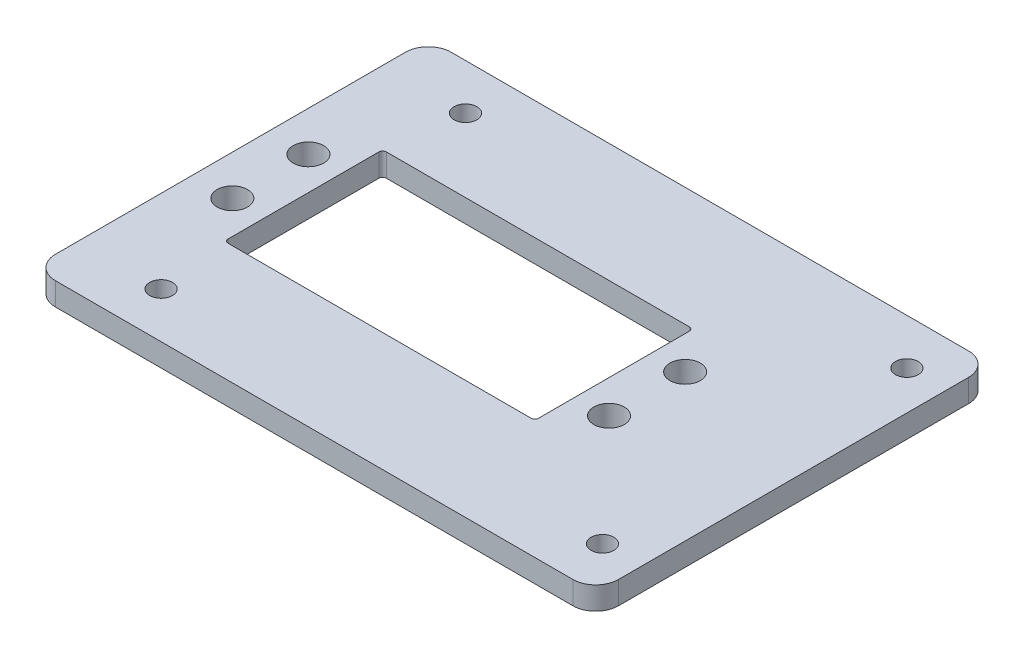
ISO-10303-21;
HEADER;
FILE_DESCRIPTION(('STEP AP214'),'2;1');
FILE_NAME('part.step','',(''),(''),'','','');
FILE_SCHEMA(('AUTOMOTIVE_DESIGN { 1 0 10303 214 1 1 1 1 }'));
ENDSEC;
DATA;
#1=APPLICATION_CONTEXT('core data for automotive mechanical design processes');
#2=APPLICATION_PROTOCOL_DEFINITION('international standard','automotive_design',2000,#1);
#3=PRODUCT_CONTEXT('',#1,'mechanical');
#4=PRODUCT('Part','Part','',(#3));
#5=PRODUCT_RELATED_PRODUCT_CATEGORY('part','',(#4));
#6=PRODUCT_DEFINITION_FORMATION('','',#4);
#7=PRODUCT_DEFINITION_CONTEXT('part definition',#1,'design');
#8=PRODUCT_DEFINITION('design','',#6,#7);
#9=PRODUCT_DEFINITION_SHAPE('','',#8);
#10=(LENGTH_UNIT() NAMED_UNIT(*) SI_UNIT(.MILLI.,.METRE.));
#11=(NAMED_UNIT(*) PLANE_ANGLE_UNIT() SI_UNIT($,.RADIAN.));
#12=(NAMED_UNIT(*) SI_UNIT($,.STERADIAN.) SOLID_ANGLE_UNIT());
#13=UNCERTAINTY_MEASURE_WITH_UNIT(LENGTH_MEASURE(1.E-05),#10,'distance_accuracy_value','');
#14=(GEOMETRIC_REPRESENTATION_CONTEXT(3) GLOBAL_UNCERTAINTY_ASSIGNED_CONTEXT((#13)) GLOBAL_UNIT_ASSIGNED_CONTEXT((#10,
#11,#12)) REPRESENTATION_CONTEXT('',''));
#15=CARTESIAN_POINT('',(0.,0.,0.));
#16=DIRECTION('',(0.,0.,1.));
#17=DIRECTION('',(1.,0.,0.));
#18=AXIS2_PLACEMENT_3D('',#15,#16,#17);
#19=CARTESIAN_POINT('',(20.4,3.,0.));
#20=DIRECTION('',(-1.,0.,0.));
#21=DIRECTION('',(0.,0.,1.));
#22=AXIS2_PLACEMENT_3D('',#19,#20,#21);
#23=PLANE('',#22);
#24=DIRECTION('',(0.,0.,-1.));
#25=VECTOR('',#24,1.);
#26=CARTESIAN_POINT('',(20.4,0.,0.));
#27=LINE('',#26,#25);
#28=CARTESIAN_POINT('',(20.4,0.,9.9));
#29=VERTEX_POINT('',#28);
#30=CARTESIAN_POINT('',(20.4,0.,-9.9));
#31=VERTEX_POINT('',#30);
#32=EDGE_CURVE('E178',#29,#31,#27,.T.);
#33=ORIENTED_EDGE('',*,*,#32,.F.);
#34=DIRECTION('',(0.,-1.,0.));
#35=VECTOR('',#34,1.);
#36=CARTESIAN_POINT('',(20.4,3.,9.9));
#37=LINE('',#36,#35);
#38=CARTESIAN_POINT('',(20.4,3.,9.9));
#39=VERTEX_POINT('',#38);
#40=EDGE_CURVE('E195',#29,#39,#37,.F.);
#41=ORIENTED_EDGE('',*,*,#40,.T.);
#42=DIRECTION('',(0.,0.,-1.));
#43=VECTOR('',#42,1.);
#44=CARTESIAN_POINT('',(20.4,3.,0.));
#45=LINE('',#44,#43);
#46=CARTESIAN_POINT('',(20.4,3.,-9.9));
#47=VERTEX_POINT('',#46);
#48=EDGE_CURVE('E307',#39,#47,#45,.T.);
#49=ORIENTED_EDGE('',*,*,#48,.T.);
#50=DIRECTION('',(0.,-1.,0.));
#51=VECTOR('',#50,1.);
#52=CARTESIAN_POINT('',(20.4,3.,-9.9));
#53=LINE('',#52,#51);
#54=EDGE_CURVE('E184',#47,#31,#53,.T.);
#55=ORIENTED_EDGE('',*,*,#54,.T.);
#56=EDGE_LOOP('',(#33,#41,#49,#55));
#57=FACE_BOUND('',#56,.T.);
#58=ADVANCED_FACE('F43',(#57),#23,.T.);
#59=CARTESIAN_POINT('',(0.,3.,10.4));
#60=DIRECTION('',(0.,0.,-1.));
#61=DIRECTION('',(-1.,0.,0.));
#62=AXIS2_PLACEMENT_3D('',#59,#60,#61);
#63=PLANE('',#62);
#64=DIRECTION('',(1.,0.,0.));
#65=VECTOR('',#64,1.);
#66=CARTESIAN_POINT('',(0.,3.,10.4));
#67=LINE('',#66,#65);
#68=CARTESIAN_POINT('',(-19.9,3.,10.4));
#69=VERTEX_POINT('',#68);
#70=CARTESIAN_POINT('',(19.9,3.,10.4));
#71=VERTEX_POINT('',#70);
#72=EDGE_CURVE('E310',#69,#71,#67,.T.);
#73=ORIENTED_EDGE('',*,*,#72,.T.);
#74=DIRECTION('',(0.,-1.,0.));
#75=VECTOR('',#74,1.);
#76=CARTESIAN_POINT('',(19.9,0.,10.4));
#77=LINE('',#76,#75);
#78=CARTESIAN_POINT('',(19.9,0.,10.4));
#79=VERTEX_POINT('',#78);
#80=EDGE_CURVE('E177',#71,#79,#77,.T.);
#81=ORIENTED_EDGE('',*,*,#80,.T.);
#82=DIRECTION('',(1.,0.,0.));
#83=VECTOR('',#82,1.);
#84=CARTESIAN_POINT('',(0.,0.,10.4));
#85=LINE('',#84,#83);
#86=CARTESIAN_POINT('',(-19.9,0.,10.4));
#87=VERTEX_POINT('',#86);
#88=EDGE_CURVE('E160',#87,#79,#85,.T.);
#89=ORIENTED_EDGE('',*,*,#88,.F.);
#90=DIRECTION('',(0.,-1.,0.));
#91=VECTOR('',#90,1.);
#92=CARTESIAN_POINT('',(-19.9,3.,10.4));
#93=LINE('',#92,#91);
#94=EDGE_CURVE('E174',#87,#69,#93,.F.);
#95=ORIENTED_EDGE('',*,*,#94,.T.);
#96=EDGE_LOOP('',(#73,#81,#89,#95));
#97=FACE_BOUND('',#96,.T.);
#98=ADVANCED_FACE('F173',(#97),#63,.T.);
#99=CARTESIAN_POINT('',(-20.4,3.,0.));
#100=DIRECTION('',(-1.,0.,0.));
#101=DIRECTION('',(0.,0.,1.));
#102=AXIS2_PLACEMENT_3D('',#99,#100,#101);
#103=PLANE('',#102);
#104=DIRECTION('',(0.,0.,-1.));
#105=VECTOR('',#104,1.);
#106=CARTESIAN_POINT('',(-20.4,3.,0.));
#107=LINE('',#106,#105);
#108=CARTESIAN_POINT('',(-20.4,3.,9.9));
#109=VERTEX_POINT('',#108);
#110=CARTESIAN_POINT('',(-20.4,3.,-9.9));
#111=VERTEX_POINT('',#110);
#112=EDGE_CURVE('E312',#109,#111,#107,.T.);
#113=ORIENTED_EDGE('',*,*,#112,.F.);
#114=DIRECTION('',(0.,-1.,0.));
#115=VECTOR('',#114,1.);
#116=CARTESIAN_POINT('',(-20.4,3.,9.9));
#117=LINE('',#116,#115);
#118=CARTESIAN_POINT('',(-20.4,0.,9.9));
#119=VERTEX_POINT('',#118);
#120=EDGE_CURVE('E199',#109,#119,#117,.T.);
#121=ORIENTED_EDGE('',*,*,#120,.T.);
#122=DIRECTION('',(0.,0.,-1.));
#123=VECTOR('',#122,1.);
#124=CARTESIAN_POINT('',(-20.4,0.,0.));
#125=LINE('',#124,#123);
#126=CARTESIAN_POINT('',(-20.4,0.,-9.9));
#127=VERTEX_POINT('',#126);
#128=EDGE_CURVE('E162',#119,#127,#125,.T.);
#129=ORIENTED_EDGE('',*,*,#128,.T.);
#130=DIRECTION('',(0.,-1.,0.));
#131=VECTOR('',#130,1.);
#132=CARTESIAN_POINT('',(-20.4,3.,-9.9));
#133=LINE('',#132,#131);
#134=EDGE_CURVE('E197',#127,#111,#133,.F.);
#135=ORIENTED_EDGE('',*,*,#134,.T.);
#136=EDGE_LOOP('',(#113,#121,#129,#135));
#137=FACE_BOUND('',#136,.T.);
#138=ADVANCED_FACE('F370',(#137),#103,.F.);
#139=CARTESIAN_POINT('',(0.,3.,26.));
#140=DIRECTION('',(0.,0.,-1.));
#141=DIRECTION('',(-1.,0.,0.));
#142=AXIS2_PLACEMENT_3D('',#139,#140,#141);
#143=PLANE('',#142);
#144=DIRECTION('',(1.,0.,0.));
#145=VECTOR('',#144,1.);
#146=CARTESIAN_POINT('',(0.,0.,26.));
#147=LINE('',#146,#145);
#148=CARTESIAN_POINT('',(-27.,0.,26.));
#149=VERTEX_POINT('',#148);
#150=CARTESIAN_POINT('',(41.,0.,26.));
#151=VERTEX_POINT('',#150);
#152=EDGE_CURVE('E338',#149,#151,#147,.T.);
#153=ORIENTED_EDGE('',*,*,#152,.T.);
#154=DIRECTION('',(0.,-1.,0.));
#155=VECTOR('',#154,1.);
#156=CARTESIAN_POINT('',(41.,3.,26.));
#157=LINE('',#156,#155);
#158=CARTESIAN_POINT('',(41.,3.,26.));
#159=VERTEX_POINT('',#158);
#160=EDGE_CURVE('E246',#151,#159,#157,.F.);
#161=ORIENTED_EDGE('',*,*,#160,.T.);
#162=DIRECTION('',(1.,0.,0.));
#163=VECTOR('',#162,1.);
#164=CARTESIAN_POINT('',(0.,3.,26.));
#165=LINE('',#164,#163);
#166=CARTESIAN_POINT('',(-27.,3.,26.));
#167=VERTEX_POINT('',#166);
#168=EDGE_CURVE('E295',#167,#159,#165,.T.);
#169=ORIENTED_EDGE('',*,*,#168,.F.);
#170=DIRECTION('',(0.,-1.,0.));
#171=VECTOR('',#170,1.);
#172=CARTESIAN_POINT('',(-27.,0.,26.));
#173=LINE('',#172,#171);
#174=EDGE_CURVE('E243',#167,#149,#173,.T.);
#175=ORIENTED_EDGE('',*,*,#174,.T.);
#176=EDGE_LOOP('',(#153,#161,#169,#175));
#177=FACE_BOUND('',#176,.T.);
#178=ADVANCED_FACE('F384',(#177),#143,.F.);
#179=CARTESIAN_POINT('',(44.,3.,0.));
#180=DIRECTION('',(1.,0.,0.));
#181=DIRECTION('',(0.,0.,-1.));
#182=AXIS2_PLACEMENT_3D('',#179,#180,#181);
#183=PLANE('',#182);
#184=DIRECTION('',(0.,0.,1.));
#185=VECTOR('',#184,1.);
#186=CARTESIAN_POINT('',(44.,0.,0.));
#187=LINE('',#186,#185);
#188=CARTESIAN_POINT('',(44.,0.,-23.));
#189=VERTEX_POINT('',#188);
#190=CARTESIAN_POINT('',(44.,0.,23.));
#191=VERTEX_POINT('',#190);
#192=EDGE_CURVE('E262',#189,#191,#187,.T.);
#193=ORIENTED_EDGE('',*,*,#192,.F.);
#194=DIRECTION('',(0.,-1.,0.));
#195=VECTOR('',#194,1.);
#196=CARTESIAN_POINT('',(44.,3.,-23.));
#197=LINE('',#196,#195);
#198=CARTESIAN_POINT('',(44.,3.,-23.));
#199=VERTEX_POINT('',#198);
#200=EDGE_CURVE('E234',#189,#199,#197,.F.);
#201=ORIENTED_EDGE('',*,*,#200,.T.);
#202=DIRECTION('',(0.,0.,1.));
#203=VECTOR('',#202,1.);
#204=CARTESIAN_POINT('',(44.,3.,0.));
#205=LINE('',#204,#203);
#206=CARTESIAN_POINT('',(44.,3.,23.));
#207=VERTEX_POINT('',#206);
#208=EDGE_CURVE('E300',#199,#207,#205,.T.);
#209=ORIENTED_EDGE('',*,*,#208,.T.);
#210=DIRECTION('',(0.,-1.,0.));
#211=VECTOR('',#210,1.);
#212=CARTESIAN_POINT('',(44.,0.,23.));
#213=LINE('',#212,#211);
#214=EDGE_CURVE('E231',#207,#191,#213,.T.);
#215=ORIENTED_EDGE('',*,*,#214,.T.);
#216=EDGE_LOOP('',(#193,#201,#209,#215));
#217=FACE_BOUND('',#216,.T.);
#218=ADVANCED_FACE('F344',(#217),#183,.T.);
#219=CARTESIAN_POINT('',(0.,3.,-26.));
#220=DIRECTION('',(0.,0.,-1.));
#221=DIRECTION('',(-1.,0.,0.));
#222=AXIS2_PLACEMENT_3D('',#219,#220,#221);
#223=PLANE('',#222);
#224=DIRECTION('',(1.,0.,0.));
#225=VECTOR('',#224,1.);
#226=CARTESIAN_POINT('',(0.,3.,-26.));
#227=LINE('',#226,#225);
#228=CARTESIAN_POINT('',(-27.,3.,-26.));
#229=VERTEX_POINT('',#228);
#230=CARTESIAN_POINT('',(41.,3.,-26.));
#231=VERTEX_POINT('',#230);
#232=EDGE_CURVE('E303',#229,#231,#227,.T.);
#233=ORIENTED_EDGE('',*,*,#232,.T.);
#234=DIRECTION('',(0.,-1.,0.));
#235=VECTOR('',#234,1.);
#236=CARTESIAN_POINT('',(41.,3.,-26.));
#237=LINE('',#236,#235);
#238=CARTESIAN_POINT('',(41.,0.,-26.));
#239=VERTEX_POINT('',#238);
#240=EDGE_CURVE('E220',#231,#239,#237,.T.);
#241=ORIENTED_EDGE('',*,*,#240,.T.);
#242=DIRECTION('',(1.,0.,0.));
#243=VECTOR('',#242,1.);
#244=CARTESIAN_POINT('',(0.,0.,-26.));
#245=LINE('',#244,#243);
#246=CARTESIAN_POINT('',(-27.,0.,-26.));
#247=VERTEX_POINT('',#246);
#248=EDGE_CURVE('E258',#247,#239,#245,.T.);
#249=ORIENTED_EDGE('',*,*,#248,.F.);
#250=DIRECTION('',(0.,-1.,0.));
#251=VECTOR('',#250,1.);
#252=CARTESIAN_POINT('',(-27.,3.,-26.));
#253=LINE('',#252,#251);
#254=EDGE_CURVE('E218',#247,#229,#253,.F.);
#255=ORIENTED_EDGE('',*,*,#254,.T.);
#256=EDGE_LOOP('',(#233,#241,#249,#255));
#257=FACE_BOUND('',#256,.T.);
#258=ADVANCED_FACE('F354',(#257),#223,.T.);
#259=CARTESIAN_POINT('',(38.89,3.,20.));
#260=DIRECTION('',(0.,-1.,0.));
#261=DIRECTION('',(0.,0.,-1.));
#262=AXIS2_PLACEMENT_3D('',#259,#260,#261);
#263=CYLINDRICAL_SURFACE('',#262,1.5);
#264=CARTESIAN_POINT('',(38.89,3.,20.));
#265=DIRECTION('',(0.,1.,0.));
#266=DIRECTION('',(0.,0.,1.));
#267=AXIS2_PLACEMENT_3D('',#264,#265,#266);
#268=CIRCLE('',#267,1.5);
#269=CARTESIAN_POINT('',(38.89,3.,21.5));
#270=VERTEX_POINT('',#269);
#271=EDGE_CURVE('E187',#270,#270,#268,.T.);
#272=ORIENTED_EDGE('',*,*,#271,.T.);
#273=EDGE_LOOP('',(#272));
#274=FACE_BOUND('',#273,.T.);
#275=CARTESIAN_POINT('',(38.89,0.,20.));
#276=DIRECTION('',(0.,1.,0.));
#277=DIRECTION('',(0.,0.,1.));
#278=AXIS2_PLACEMENT_3D('',#275,#276,#277);
#279=CIRCLE('',#278,1.5);
#280=CARTESIAN_POINT('',(38.89,0.,21.5));
#281=VERTEX_POINT('',#280);
#282=EDGE_CURVE('E281',#281,#281,#279,.T.);
#283=ORIENTED_EDGE('',*,*,#282,.F.);
#284=EDGE_LOOP('',(#283));
#285=FACE_BOUND('',#284,.T.);
#286=ADVANCED_FACE('F381',(#274,#285),#263,.F.);
#287=CARTESIAN_POINT('',(-19.11,3.,20.));
#288=DIRECTION('',(0.,-1.,0.));
#289=DIRECTION('',(0.,0.,-1.));
#290=AXIS2_PLACEMENT_3D('',#287,#288,#289);
#291=CYLINDRICAL_SURFACE('',#290,1.5);
#292=CARTESIAN_POINT('',(-19.11,3.,20.));
#293=DIRECTION('',(0.,1.,0.));
#294=DIRECTION('',(0.,0.,1.));
#295=AXIS2_PLACEMENT_3D('',#292,#293,#294);
#296=CIRCLE('',#295,1.5);
#297=CARTESIAN_POINT('',(-19.11,3.,21.5));
#298=VERTEX_POINT('',#297);
#299=EDGE_CURVE('E327',#298,#298,#296,.F.);
#300=ORIENTED_EDGE('',*,*,#299,.F.);
#301=EDGE_LOOP('',(#300));
#302=FACE_BOUND('',#301,.T.);
#303=CARTESIAN_POINT('',(-19.11,0.,20.));
#304=DIRECTION('',(0.,1.,0.));
#305=DIRECTION('',(0.,0.,1.));
#306=AXIS2_PLACEMENT_3D('',#303,#304,#305);
#307=CIRCLE('',#306,1.5);
#308=CARTESIAN_POINT('',(-19.11,0.,21.5));
#309=VERTEX_POINT('',#308);
#310=EDGE_CURVE('E279',#309,#309,#307,.F.);
#311=ORIENTED_EDGE('',*,*,#310,.T.);
#312=EDGE_LOOP('',(#311));
#313=FACE_BOUND('',#312,.T.);
#314=ADVANCED_FACE('F532',(#302,#313),#291,.F.);
#315=CARTESIAN_POINT('',(-19.11,3.,-20.));
#316=DIRECTION('',(0.,-1.,0.));
#317=DIRECTION('',(0.,0.,-1.));
#318=AXIS2_PLACEMENT_3D('',#315,#316,#317);
#319=CYLINDRICAL_SURFACE('',#318,1.5);
#320=CARTESIAN_POINT('',(-19.11,3.,-20.));
#321=DIRECTION('',(0.,1.,0.));
#322=DIRECTION('',(0.,0.,1.));
#323=AXIS2_PLACEMENT_3D('',#320,#321,#322);
#324=CIRCLE('',#323,1.5);
#325=CARTESIAN_POINT('',(-19.11,3.,-18.5));
#326=VERTEX_POINT('',#325);
#327=EDGE_CURVE('E324',#326,#326,#324,.T.);
#328=ORIENTED_EDGE('',*,*,#327,.T.);
#329=EDGE_LOOP('',(#328));
#330=FACE_BOUND('',#329,.T.);
#331=CARTESIAN_POINT('',(-19.11,0.,-20.));
#332=DIRECTION('',(0.,1.,0.));
#333=DIRECTION('',(0.,0.,1.));
#334=AXIS2_PLACEMENT_3D('',#331,#332,#333);
#335=CIRCLE('',#334,1.5);
#336=CARTESIAN_POINT('',(-19.11,0.,-18.5));
#337=VERTEX_POINT('',#336);
#338=EDGE_CURVE('E276',#337,#337,#335,.T.);
#339=ORIENTED_EDGE('',*,*,#338,.F.);
#340=EDGE_LOOP('',(#339));
#341=FACE_BOUND('',#340,.T.);
#342=ADVANCED_FACE('F523',(#330,#341),#319,.F.);
#343=CARTESIAN_POINT('',(24.75,3.,4.99999999999999));
#344=DIRECTION('',(0.,-1.,0.));
#345=DIRECTION('',(0.,0.,-1.));
#346=AXIS2_PLACEMENT_3D('',#343,#344,#345);
#347=CYLINDRICAL_SURFACE('',#346,2.);
#348=CARTESIAN_POINT('',(24.75,3.,4.99999999999999));
#349=DIRECTION('',(0.,1.,0.));
#350=DIRECTION('',(0.,0.,1.));
#351=AXIS2_PLACEMENT_3D('',#348,#349,#350);
#352=CIRCLE('',#351,2.);
#353=CARTESIAN_POINT('',(24.75,3.,7.));
#354=VERTEX_POINT('',#353);
#355=EDGE_CURVE('E321',#354,#354,#352,.F.);
#356=ORIENTED_EDGE('',*,*,#355,.F.);
#357=EDGE_LOOP('',(#356));
#358=FACE_BOUND('',#357,.T.);
#359=CARTESIAN_POINT('',(24.75,0.,4.99999999999999));
#360=DIRECTION('',(0.,1.,0.));
#361=DIRECTION('',(0.,0.,1.));
#362=AXIS2_PLACEMENT_3D('',#359,#360,#361);
#363=CIRCLE('',#362,2.);
#364=CARTESIAN_POINT('',(24.75,0.,7.));
#365=VERTEX_POINT('',#364);
#366=EDGE_CURVE('E273',#365,#365,#363,.F.);
#367=ORIENTED_EDGE('',*,*,#366,.T.);
#368=EDGE_LOOP('',(#367));
#369=FACE_BOUND('',#368,.T.);
#370=ADVANCED_FACE('F514',(#358,#369),#347,.F.);
#371=CARTESIAN_POINT('',(24.75,3.,-5.00000000000001));
#372=DIRECTION('',(0.,-1.,0.));
#373=DIRECTION('',(0.,0.,-1.));
#374=AXIS2_PLACEMENT_3D('',#371,#372,#373);
#375=CYLINDRICAL_SURFACE('',#374,2.);
#376=CARTESIAN_POINT('',(24.75,3.,-5.00000000000001));
#377=DIRECTION('',(0.,1.,0.));
#378=DIRECTION('',(0.,0.,1.));
#379=AXIS2_PLACEMENT_3D('',#376,#377,#378);
#380=CIRCLE('',#379,2.);
#381=CARTESIAN_POINT('',(24.75,3.,-3.));
#382=VERTEX_POINT('',#381);
#383=EDGE_CURVE('E318',#382,#382,#380,.T.);
#384=ORIENTED_EDGE('',*,*,#383,.T.);
#385=EDGE_LOOP('',(#384));
#386=FACE_BOUND('',#385,.T.);
#387=CARTESIAN_POINT('',(24.75,0.,-5.00000000000001));
#388=DIRECTION('',(0.,1.,0.));
#389=DIRECTION('',(0.,0.,1.));
#390=AXIS2_PLACEMENT_3D('',#387,#388,#389);
#391=CIRCLE('',#390,2.);
#392=CARTESIAN_POINT('',(24.75,0.,-3.));
#393=VERTEX_POINT('',#392);
#394=EDGE_CURVE('E270',#393,#393,#391,.T.);
#395=ORIENTED_EDGE('',*,*,#394,.F.);
#396=EDGE_LOOP('',(#395));
#397=FACE_BOUND('',#396,.T.);
#398=ADVANCED_FACE('F505',(#386,#397),#375,.F.);
#399=CARTESIAN_POINT('',(0.,3.,-10.4));
#400=DIRECTION('',(0.,0.,-1.));
#401=DIRECTION('',(-1.,0.,0.));
#402=AXIS2_PLACEMENT_3D('',#399,#400,#401);
#403=PLANE('',#402);
#404=DIRECTION('',(1.,0.,0.));
#405=VECTOR('',#404,1.);
#406=CARTESIAN_POINT('',(0.,0.,-10.4));
#407=LINE('',#406,#405);
#408=CARTESIAN_POINT('',(-19.9,0.,-10.4));
#409=VERTEX_POINT('',#408);
#410=CARTESIAN_POINT('',(19.9,0.,-10.4));
#411=VERTEX_POINT('',#410);
#412=EDGE_CURVE('E267',#409,#411,#407,.T.);
#413=ORIENTED_EDGE('',*,*,#412,.T.);
#414=DIRECTION('',(0.,-1.,0.));
#415=VECTOR('',#414,1.);
#416=CARTESIAN_POINT('',(19.9,3.,-10.4));
#417=LINE('',#416,#415);
#418=CARTESIAN_POINT('',(19.9,3.,-10.4));
#419=VERTEX_POINT('',#418);
#420=EDGE_CURVE('E204',#411,#419,#417,.F.);
#421=ORIENTED_EDGE('',*,*,#420,.T.);
#422=DIRECTION('',(1.,0.,0.));
#423=VECTOR('',#422,1.);
#424=CARTESIAN_POINT('',(0.,3.,-10.4));
#425=LINE('',#424,#423);
#426=CARTESIAN_POINT('',(-19.9,3.,-10.4));
#427=VERTEX_POINT('',#426);
#428=EDGE_CURVE('E315',#427,#419,#425,.T.);
#429=ORIENTED_EDGE('',*,*,#428,.F.);
#430=DIRECTION('',(0.,-1.,0.));
#431=VECTOR('',#430,1.);
#432=CARTESIAN_POINT('',(-19.9,0.,-10.4));
#433=LINE('',#432,#431);
#434=EDGE_CURVE('E201',#427,#409,#433,.T.);
#435=ORIENTED_EDGE('',*,*,#434,.T.);
#436=EDGE_LOOP('',(#413,#421,#429,#435));
#437=FACE_BOUND('',#436,.T.);
#438=ADVANCED_FACE('F378',(#437),#403,.F.);
#439=CARTESIAN_POINT('',(-30.,3.,0.));
#440=DIRECTION('',(-1.,0.,0.));
#441=DIRECTION('',(0.,0.,1.));
#442=AXIS2_PLACEMENT_3D('',#439,#440,#441);
#443=PLANE('',#442);
#444=DIRECTION('',(0.,0.,-1.));
#445=VECTOR('',#444,1.);
#446=CARTESIAN_POINT('',(-30.,0.,0.));
#447=LINE('',#446,#445);
#448=CARTESIAN_POINT('',(-30.,0.,23.));
#449=VERTEX_POINT('',#448);
#450=CARTESIAN_POINT('',(-30.,0.,-23.));
#451=VERTEX_POINT('',#450);
#452=EDGE_CURVE('E251',#449,#451,#447,.T.);
#453=ORIENTED_EDGE('',*,*,#452,.F.);
#454=DIRECTION('',(0.,-1.,0.));
#455=VECTOR('',#454,1.);
#456=CARTESIAN_POINT('',(-30.,3.,23.));
#457=LINE('',#456,#455);
#458=CARTESIAN_POINT('',(-30.,3.,23.));
#459=VERTEX_POINT('',#458);
#460=EDGE_CURVE('E11',#449,#459,#457,.F.);
#461=ORIENTED_EDGE('',*,*,#460,.T.);
#462=DIRECTION('',(0.,0.,-1.));
#463=VECTOR('',#462,1.);
#464=CARTESIAN_POINT('',(-30.,3.,0.));
#465=LINE('',#464,#463);
#466=CARTESIAN_POINT('',(-30.,3.,-23.));
#467=VERTEX_POINT('',#466);
#468=EDGE_CURVE('E252',#459,#467,#465,.T.);
#469=ORIENTED_EDGE('',*,*,#468,.T.);
#470=DIRECTION('',(0.,-1.,0.));
#471=VECTOR('',#470,1.);
#472=CARTESIAN_POINT('',(-30.,3.,-23.));
#473=LINE('',#472,#471);
#474=EDGE_CURVE('E51',#467,#451,#473,.T.);
#475=ORIENTED_EDGE('',*,*,#474,.T.);
#476=EDGE_LOOP('',(#453,#461,#469,#475));
#477=FACE_BOUND('',#476,.T.);
#478=ADVANCED_FACE('F250',(#477),#443,.T.);
#479=CARTESIAN_POINT('',(-24.75,3.,4.99999999999999));
#480=DIRECTION('',(0.,-1.,0.));
#481=DIRECTION('',(0.,0.,-1.));
#482=AXIS2_PLACEMENT_3D('',#479,#480,#481);
#483=CYLINDRICAL_SURFACE('',#482,2.);
#484=CARTESIAN_POINT('',(-24.75,3.,4.99999999999999));
#485=DIRECTION('',(0.,1.,0.));
#486=DIRECTION('',(0.,0.,1.));
#487=AXIS2_PLACEMENT_3D('',#484,#485,#486);
#488=CIRCLE('',#487,2.);
#489=CARTESIAN_POINT('',(-24.75,3.,7.));
#490=VERTEX_POINT('',#489);
#491=EDGE_CURVE('E290',#490,#490,#488,.T.);
#492=ORIENTED_EDGE('',*,*,#491,.T.);
#493=EDGE_LOOP('',(#492));
#494=FACE_BOUND('',#493,.T.);
#495=CARTESIAN_POINT('',(-24.75,0.,4.99999999999999));
#496=DIRECTION('',(0.,1.,0.));
#497=DIRECTION('',(0.,0.,1.));
#498=AXIS2_PLACEMENT_3D('',#495,#496,#497);
#499=CIRCLE('',#498,2.);
#500=CARTESIAN_POINT('',(-24.75,0.,7.));
#501=VERTEX_POINT('',#500);
#502=EDGE_CURVE('E335',#501,#501,#499,.T.);
#503=ORIENTED_EDGE('',*,*,#502,.F.);
#504=EDGE_LOOP('',(#503));
#505=FACE_BOUND('',#504,.T.);
#506=ADVANCED_FACE('F377',(#494,#505),#483,.F.);
#507=CARTESIAN_POINT('',(-24.75,3.,-5.00000000000001));
#508=DIRECTION('',(0.,-1.,0.));
#509=DIRECTION('',(0.,0.,-1.));
#510=AXIS2_PLACEMENT_3D('',#507,#508,#509);
#511=CYLINDRICAL_SURFACE('',#510,2.);
#512=CARTESIAN_POINT('',(-24.75,3.,-5.00000000000001));
#513=DIRECTION('',(0.,1.,0.));
#514=DIRECTION('',(0.,0.,1.));
#515=AXIS2_PLACEMENT_3D('',#512,#513,#514);
#516=CIRCLE('',#515,2.);
#517=CARTESIAN_POINT('',(-24.75,3.,-3.));
#518=VERTEX_POINT('',#517);
#519=EDGE_CURVE('E286',#518,#518,#516,.F.);
#520=ORIENTED_EDGE('',*,*,#519,.F.);
#521=EDGE_LOOP('',(#520));
#522=FACE_BOUND('',#521,.T.);
#523=CARTESIAN_POINT('',(-24.75,0.,-5.00000000000001));
#524=DIRECTION('',(0.,1.,0.));
#525=DIRECTION('',(0.,0.,1.));
#526=AXIS2_PLACEMENT_3D('',#523,#524,#525);
#527=CIRCLE('',#526,2.);
#528=CARTESIAN_POINT('',(-24.75,0.,-3.));
#529=VERTEX_POINT('',#528);
#530=EDGE_CURVE('E332',#529,#529,#527,.F.);
#531=ORIENTED_EDGE('',*,*,#530,.T.);
#532=EDGE_LOOP('',(#531));
#533=FACE_BOUND('',#532,.T.);
#534=ADVANCED_FACE('F390',(#522,#533),#511,.F.);
#535=CARTESIAN_POINT('',(38.89,3.,-20.));
#536=DIRECTION('',(0.,-1.,0.));
#537=DIRECTION('',(0.,0.,-1.));
#538=AXIS2_PLACEMENT_3D('',#535,#536,#537);
#539=CYLINDRICAL_SURFACE('',#538,1.5);
#540=CARTESIAN_POINT('',(38.89,3.,-20.));
#541=DIRECTION('',(0.,1.,0.));
#542=DIRECTION('',(0.,0.,1.));
#543=AXIS2_PLACEMENT_3D('',#540,#541,#542);
#544=CIRCLE('',#543,1.5);
#545=CARTESIAN_POINT('',(38.89,3.,-18.5));
#546=VERTEX_POINT('',#545);
#547=EDGE_CURVE('E182',#546,#546,#544,.F.);
#548=ORIENTED_EDGE('',*,*,#547,.F.);
#549=EDGE_LOOP('',(#548));
#550=FACE_BOUND('',#549,.T.);
#551=CARTESIAN_POINT('',(38.89,0.,-20.));
#552=DIRECTION('',(0.,1.,0.));
#553=DIRECTION('',(0.,0.,1.));
#554=AXIS2_PLACEMENT_3D('',#551,#552,#553);
#555=CIRCLE('',#554,1.5);
#556=CARTESIAN_POINT('',(38.89,0.,-18.5));
#557=VERTEX_POINT('',#556);
#558=EDGE_CURVE('E190',#557,#557,#555,.F.);
#559=ORIENTED_EDGE('',*,*,#558,.T.);
#560=EDGE_LOOP('',(#559));
#561=FACE_BOUND('',#560,.T.);
#562=ADVANCED_FACE('F394',(#550,#561),#539,.F.);
#563=CARTESIAN_POINT('',(0.,3.,0.));
#564=DIRECTION('',(0.,1.,0.));
#565=DIRECTION('',(0.,0.,1.));
#566=AXIS2_PLACEMENT_3D('',#563,#564,#565);
#567=PLANE('',#566);
#568=ORIENTED_EDGE('',*,*,#519,.T.);
#569=EDGE_LOOP('',(#568));
#570=FACE_BOUND('',#569,.T.);
#571=ORIENTED_EDGE('',*,*,#491,.F.);
#572=EDGE_LOOP('',(#571));
#573=FACE_BOUND('',#572,.T.);
#574=ORIENTED_EDGE('',*,*,#208,.F.);
#575=CARTESIAN_POINT('',(41.,3.,-23.));
#576=DIRECTION('',(0.,1.,0.));
#577=DIRECTION('',(0.,0.,1.));
#578=AXIS2_PLACEMENT_3D('',#575,#576,#577);
#579=CIRCLE('',#578,3.);
#580=EDGE_CURVE('E241',#199,#231,#579,.T.);
#581=ORIENTED_EDGE('',*,*,#580,.T.);
#582=ORIENTED_EDGE('',*,*,#232,.F.);
#583=CARTESIAN_POINT('',(-27.,3.,-23.));
#584=DIRECTION('',(0.,1.,0.));
#585=DIRECTION('',(0.,0.,1.));
#586=AXIS2_PLACEMENT_3D('',#583,#584,#585);
#587=CIRCLE('',#586,3.);
#588=EDGE_CURVE('E58',#229,#467,#587,.T.);
#589=ORIENTED_EDGE('',*,*,#588,.T.);
#590=ORIENTED_EDGE('',*,*,#468,.F.);
#591=CARTESIAN_POINT('',(-27.,3.,23.));
#592=DIRECTION('',(0.,1.,0.));
#593=DIRECTION('',(0.,0.,1.));
#594=AXIS2_PLACEMENT_3D('',#591,#592,#593);
#595=CIRCLE('',#594,3.);
#596=EDGE_CURVE('E237',#459,#167,#595,.T.);
#597=ORIENTED_EDGE('',*,*,#596,.T.);
#598=ORIENTED_EDGE('',*,*,#168,.T.);
#599=CARTESIAN_POINT('',(41.,3.,23.));
#600=DIRECTION('',(0.,1.,0.));
#601=DIRECTION('',(0.,0.,1.));
#602=AXIS2_PLACEMENT_3D('',#599,#600,#601);
#603=CIRCLE('',#602,3.);
#604=EDGE_CURVE('E239',#159,#207,#603,.T.);
#605=ORIENTED_EDGE('',*,*,#604,.T.);
#606=EDGE_LOOP('',(#574,#581,#582,#589,#590,#597,#598,#605));
#607=FACE_BOUND('',#606,.T.);
#608=ORIENTED_EDGE('',*,*,#48,.F.);
#609=CARTESIAN_POINT('',(19.9,3.,9.9));
#610=DIRECTION('',(0.,1.,0.));
#611=DIRECTION('',(0.,0.,1.));
#612=AXIS2_PLACEMENT_3D('',#609,#610,#611);
#613=CIRCLE('',#612,0.5);
#614=EDGE_CURVE('E168',#39,#71,#613,.F.);
#615=ORIENTED_EDGE('',*,*,#614,.T.);
#616=ORIENTED_EDGE('',*,*,#72,.F.);
#617=CARTESIAN_POINT('',(-19.9,3.,9.9));
#618=DIRECTION('',(0.,1.,0.));
#619=DIRECTION('',(0.,0.,1.));
#620=AXIS2_PLACEMENT_3D('',#617,#618,#619);
#621=CIRCLE('',#620,0.5);
#622=EDGE_CURVE('E167',#69,#109,#621,.F.);
#623=ORIENTED_EDGE('',*,*,#622,.T.);
#624=ORIENTED_EDGE('',*,*,#112,.T.);
#625=CARTESIAN_POINT('',(-19.9,3.,-9.9));
#626=DIRECTION('',(0.,1.,0.));
#627=DIRECTION('',(0.,0.,1.));
#628=AXIS2_PLACEMENT_3D('',#625,#626,#627);
#629=CIRCLE('',#628,0.5);
#630=EDGE_CURVE('E216',#111,#427,#629,.F.);
#631=ORIENTED_EDGE('',*,*,#630,.T.);
#632=ORIENTED_EDGE('',*,*,#428,.T.);
#633=CARTESIAN_POINT('',(19.9,3.,-9.9));
#634=DIRECTION('',(0.,1.,0.));
#635=DIRECTION('',(0.,0.,1.));
#636=AXIS2_PLACEMENT_3D('',#633,#634,#635);
#637=CIRCLE('',#636,0.5);
#638=EDGE_CURVE('E212',#419,#47,#637,.F.);
#639=ORIENTED_EDGE('',*,*,#638,.T.);
#640=EDGE_LOOP('',(#608,#615,#616,#623,#624,#631,#632,#639));
#641=FACE_BOUND('',#640,.T.);
#642=ORIENTED_EDGE('',*,*,#383,.F.);
#643=EDGE_LOOP('',(#642));
#644=FACE_BOUND('',#643,.T.);
#645=ORIENTED_EDGE('',*,*,#355,.T.);
#646=EDGE_LOOP('',(#645));
#647=FACE_BOUND('',#646,.T.);
#648=ORIENTED_EDGE('',*,*,#327,.F.);
#649=EDGE_LOOP('',(#648));
#650=FACE_BOUND('',#649,.T.);
#651=ORIENTED_EDGE('',*,*,#299,.T.);
#652=EDGE_LOOP('',(#651));
#653=FACE_BOUND('',#652,.T.);
#654=ORIENTED_EDGE('',*,*,#271,.F.);
#655=EDGE_LOOP('',(#654));
#656=FACE_BOUND('',#655,.T.);
#657=ORIENTED_EDGE('',*,*,#547,.T.);
#658=EDGE_LOOP('',(#657));
#659=FACE_BOUND('',#658,.T.);
#660=ADVANCED_FACE('F351',(#570,#573,#607,#641,#644,#647,#650,#653,#656,#659),#567,.T.);
#661=CARTESIAN_POINT('',(0.,0.,0.));
#662=DIRECTION('',(0.,1.,0.));
#663=DIRECTION('',(0.,0.,1.));
#664=AXIS2_PLACEMENT_3D('',#661,#662,#663);
#665=PLANE('',#664);
#666=ORIENTED_EDGE('',*,*,#530,.F.);
#667=EDGE_LOOP('',(#666));
#668=FACE_BOUND('',#667,.T.);
#669=ORIENTED_EDGE('',*,*,#502,.T.);
#670=EDGE_LOOP('',(#669));
#671=FACE_BOUND('',#670,.T.);
#672=ORIENTED_EDGE('',*,*,#248,.T.);
#673=CARTESIAN_POINT('',(41.,0.,-23.));
#674=DIRECTION('',(0.,1.,0.));
#675=DIRECTION('',(0.,0.,1.));
#676=AXIS2_PLACEMENT_3D('',#673,#674,#675);
#677=CIRCLE('',#676,3.);
#678=EDGE_CURVE('E229',#239,#189,#677,.F.);
#679=ORIENTED_EDGE('',*,*,#678,.T.);
#680=ORIENTED_EDGE('',*,*,#192,.T.);
#681=CARTESIAN_POINT('',(41.,0.,23.));
#682=DIRECTION('',(0.,1.,0.));
#683=DIRECTION('',(0.,0.,1.));
#684=AXIS2_PLACEMENT_3D('',#681,#682,#683);
#685=CIRCLE('',#684,3.);
#686=EDGE_CURVE('E227',#191,#151,#685,.F.);
#687=ORIENTED_EDGE('',*,*,#686,.T.);
#688=ORIENTED_EDGE('',*,*,#152,.F.);
#689=CARTESIAN_POINT('',(-27.,0.,23.));
#690=DIRECTION('',(0.,1.,0.));
#691=DIRECTION('',(0.,0.,1.));
#692=AXIS2_PLACEMENT_3D('',#689,#690,#691);
#693=CIRCLE('',#692,3.);
#694=EDGE_CURVE('E225',#149,#449,#693,.F.);
#695=ORIENTED_EDGE('',*,*,#694,.T.);
#696=ORIENTED_EDGE('',*,*,#452,.T.);
#697=CARTESIAN_POINT('',(-27.,0.,-23.));
#698=DIRECTION('',(0.,1.,0.));
#699=DIRECTION('',(0.,0.,1.));
#700=AXIS2_PLACEMENT_3D('',#697,#698,#699);
#701=CIRCLE('',#700,3.);
#702=EDGE_CURVE('E223',#451,#247,#701,.F.);
#703=ORIENTED_EDGE('',*,*,#702,.T.);
#704=EDGE_LOOP('',(#672,#679,#680,#687,#688,#695,#696,#703));
#705=FACE_BOUND('',#704,.T.);
#706=ORIENTED_EDGE('',*,*,#88,.T.);
#707=CARTESIAN_POINT('',(19.9,0.,9.9));
#708=DIRECTION('',(0.,1.,0.));
#709=DIRECTION('',(0.,0.,1.));
#710=AXIS2_PLACEMENT_3D('',#707,#708,#709);
#711=CIRCLE('',#710,0.5);
#712=EDGE_CURVE('E206',#79,#29,#711,.T.);
#713=ORIENTED_EDGE('',*,*,#712,.T.);
#714=ORIENTED_EDGE('',*,*,#32,.T.);
#715=CARTESIAN_POINT('',(19.9,0.,-9.9));
#716=DIRECTION('',(0.,1.,0.));
#717=DIRECTION('',(0.,0.,1.));
#718=AXIS2_PLACEMENT_3D('',#715,#716,#717);
#719=CIRCLE('',#718,0.5);
#720=EDGE_CURVE('E210',#31,#411,#719,.T.);
#721=ORIENTED_EDGE('',*,*,#720,.T.);
#722=ORIENTED_EDGE('',*,*,#412,.F.);
#723=CARTESIAN_POINT('',(-19.9,0.,-9.9));
#724=DIRECTION('',(0.,1.,0.));
#725=DIRECTION('',(0.,0.,1.));
#726=AXIS2_PLACEMENT_3D('',#723,#724,#725);
#727=CIRCLE('',#726,0.5);
#728=EDGE_CURVE('E214',#409,#127,#727,.T.);
#729=ORIENTED_EDGE('',*,*,#728,.T.);
#730=ORIENTED_EDGE('',*,*,#128,.F.);
#731=CARTESIAN_POINT('',(-19.9,0.,9.9));
#732=DIRECTION('',(0.,1.,0.));
#733=DIRECTION('',(0.,0.,1.));
#734=AXIS2_PLACEMENT_3D('',#731,#732,#733);
#735=CIRCLE('',#734,0.5);
#736=EDGE_CURVE('E156',#119,#87,#735,.T.);
#737=ORIENTED_EDGE('',*,*,#736,.T.);
#738=EDGE_LOOP('',(#706,#713,#714,#721,#722,#729,#730,#737));
#739=FACE_BOUND('',#738,.T.);
#740=ORIENTED_EDGE('',*,*,#394,.T.);
#741=EDGE_LOOP('',(#740));
#742=FACE_BOUND('',#741,.T.);
#743=ORIENTED_EDGE('',*,*,#366,.F.);
#744=EDGE_LOOP('',(#743));
#745=FACE_BOUND('',#744,.T.);
#746=ORIENTED_EDGE('',*,*,#338,.T.);
#747=EDGE_LOOP('',(#746));
#748=FACE_BOUND('',#747,.T.);
#749=ORIENTED_EDGE('',*,*,#310,.F.);
#750=EDGE_LOOP('',(#749));
#751=FACE_BOUND('',#750,.T.);
#752=ORIENTED_EDGE('',*,*,#282,.T.);
#753=EDGE_LOOP('',(#752));
#754=FACE_BOUND('',#753,.T.);
#755=ORIENTED_EDGE('',*,*,#558,.F.);
#756=EDGE_LOOP('',(#755));
#757=FACE_BOUND('',#756,.T.);
#758=ADVANCED_FACE('F158',(#668,#671,#705,#739,#742,#745,#748,#751,#754,#757),#665,.F.);
#759=CARTESIAN_POINT('',(19.9,3.,9.9));
#760=DIRECTION('',(0.,1.,0.));
#761=DIRECTION('',(0.,0.,1.));
#762=AXIS2_PLACEMENT_3D('',#759,#760,#761);
#763=CYLINDRICAL_SURFACE('',#762,0.5);
#764=ORIENTED_EDGE('',*,*,#614,.F.);
#765=ORIENTED_EDGE('',*,*,#40,.F.);
#766=ORIENTED_EDGE('',*,*,#712,.F.);
#767=ORIENTED_EDGE('',*,*,#80,.F.);
#768=EDGE_LOOP('',(#764,#765,#766,#767));
#769=FACE_BOUND('',#768,.T.);
#770=ADVANCED_FACE('F396',(#769),#763,.F.);
#771=CARTESIAN_POINT('',(-19.9,3.,9.9));
#772=DIRECTION('',(0.,-1.,0.));
#773=DIRECTION('',(0.,0.,-1.));
#774=AXIS2_PLACEMENT_3D('',#771,#772,#773);
#775=CYLINDRICAL_SURFACE('',#774,0.5);
#776=ORIENTED_EDGE('',*,*,#622,.F.);
#777=ORIENTED_EDGE('',*,*,#94,.F.);
#778=ORIENTED_EDGE('',*,*,#736,.F.);
#779=ORIENTED_EDGE('',*,*,#120,.F.);
#780=EDGE_LOOP('',(#776,#777,#778,#779));
#781=FACE_BOUND('',#780,.T.);
#782=ADVANCED_FACE('F181',(#781),#775,.F.);
#783=CARTESIAN_POINT('',(19.9,3.,-9.9));
#784=DIRECTION('',(0.,-1.,0.));
#785=DIRECTION('',(0.,0.,-1.));
#786=AXIS2_PLACEMENT_3D('',#783,#784,#785);
#787=CYLINDRICAL_SURFACE('',#786,0.5);
#788=ORIENTED_EDGE('',*,*,#638,.F.);
#789=ORIENTED_EDGE('',*,*,#420,.F.);
#790=ORIENTED_EDGE('',*,*,#720,.F.);
#791=ORIENTED_EDGE('',*,*,#54,.F.);
#792=EDGE_LOOP('',(#788,#789,#790,#791));
#793=FACE_BOUND('',#792,.T.);
#794=ADVANCED_FACE('F402',(#793),#787,.F.);
#795=CARTESIAN_POINT('',(-19.9,3.,-9.9));
#796=DIRECTION('',(0.,1.,0.));
#797=DIRECTION('',(0.,0.,1.));
#798=AXIS2_PLACEMENT_3D('',#795,#796,#797);
#799=CYLINDRICAL_SURFACE('',#798,0.5);
#800=ORIENTED_EDGE('',*,*,#630,.F.);
#801=ORIENTED_EDGE('',*,*,#134,.F.);
#802=ORIENTED_EDGE('',*,*,#728,.F.);
#803=ORIENTED_EDGE('',*,*,#434,.F.);
#804=EDGE_LOOP('',(#800,#801,#802,#803));
#805=FACE_BOUND('',#804,.T.);
#806=ADVANCED_FACE('F405',(#805),#799,.F.);
#807=CARTESIAN_POINT('',(41.,3.,-23.));
#808=DIRECTION('',(0.,-1.,0.));
#809=DIRECTION('',(0.,0.,-1.));
#810=AXIS2_PLACEMENT_3D('',#807,#808,#809);
#811=CYLINDRICAL_SURFACE('',#810,3.);
#812=ORIENTED_EDGE('',*,*,#580,.F.);
#813=ORIENTED_EDGE('',*,*,#200,.F.);
#814=ORIENTED_EDGE('',*,*,#678,.F.);
#815=ORIENTED_EDGE('',*,*,#240,.F.);
#816=EDGE_LOOP('',(#812,#813,#814,#815));
#817=FACE_BOUND('',#816,.T.);
#818=ADVANCED_FACE('F349',(#817),#811,.T.);
#819=CARTESIAN_POINT('',(41.,3.,23.));
#820=DIRECTION('',(0.,1.,0.));
#821=DIRECTION('',(0.,0.,1.));
#822=AXIS2_PLACEMENT_3D('',#819,#820,#821);
#823=CYLINDRICAL_SURFACE('',#822,3.);
#824=ORIENTED_EDGE('',*,*,#604,.F.);
#825=ORIENTED_EDGE('',*,*,#160,.F.);
#826=ORIENTED_EDGE('',*,*,#686,.F.);
#827=ORIENTED_EDGE('',*,*,#214,.F.);
#828=EDGE_LOOP('',(#824,#825,#826,#827));
#829=FACE_BOUND('',#828,.T.);
#830=ADVANCED_FACE('F361',(#829),#823,.T.);
#831=CARTESIAN_POINT('',(-27.,3.,23.));
#832=DIRECTION('',(0.,1.,0.));
#833=DIRECTION('',(0.,0.,1.));
#834=AXIS2_PLACEMENT_3D('',#831,#832,#833);
#835=CYLINDRICAL_SURFACE('',#834,3.);
#836=ORIENTED_EDGE('',*,*,#596,.F.);
#837=ORIENTED_EDGE('',*,*,#460,.F.);
#838=ORIENTED_EDGE('',*,*,#694,.F.);
#839=ORIENTED_EDGE('',*,*,#174,.F.);
#840=EDGE_LOOP('',(#836,#837,#838,#839));
#841=FACE_BOUND('',#840,.T.);
#842=ADVANCED_FACE('F357',(#841),#835,.T.);
#843=CARTESIAN_POINT('',(-27.,3.,-23.));
#844=DIRECTION('',(0.,-1.,0.));
#845=DIRECTION('',(0.,0.,-1.));
#846=AXIS2_PLACEMENT_3D('',#843,#844,#845);
#847=CYLINDRICAL_SURFACE('',#846,3.);
#848=ORIENTED_EDGE('',*,*,#588,.F.);
#849=ORIENTED_EDGE('',*,*,#254,.F.);
#850=ORIENTED_EDGE('',*,*,#702,.F.);
#851=ORIENTED_EDGE('',*,*,#474,.F.);
#852=EDGE_LOOP('',(#848,#849,#850,#851));
#853=FACE_BOUND('',#852,.T.);
#854=ADVANCED_FACE('F45',(#853),#847,.T.);
#855=CLOSED_SHELL('',(#58,#98,#138,#178,#218,#258,#286,#314,#342,#370,#398,#438,#478,#506,#534,
#562,#660,#758,#770,#782,#794,#806,#818,#830,#842,#854));
#856=MANIFOLD_SOLID_BREP('B2',#855);
#857=ADVANCED_BREP_SHAPE_REPRESENTATION('',(#18,#856),#14);
#858=SHAPE_DEFINITION_REPRESENTATION(#9,#857);
ENDSEC;
END-ISO-10303-21;
